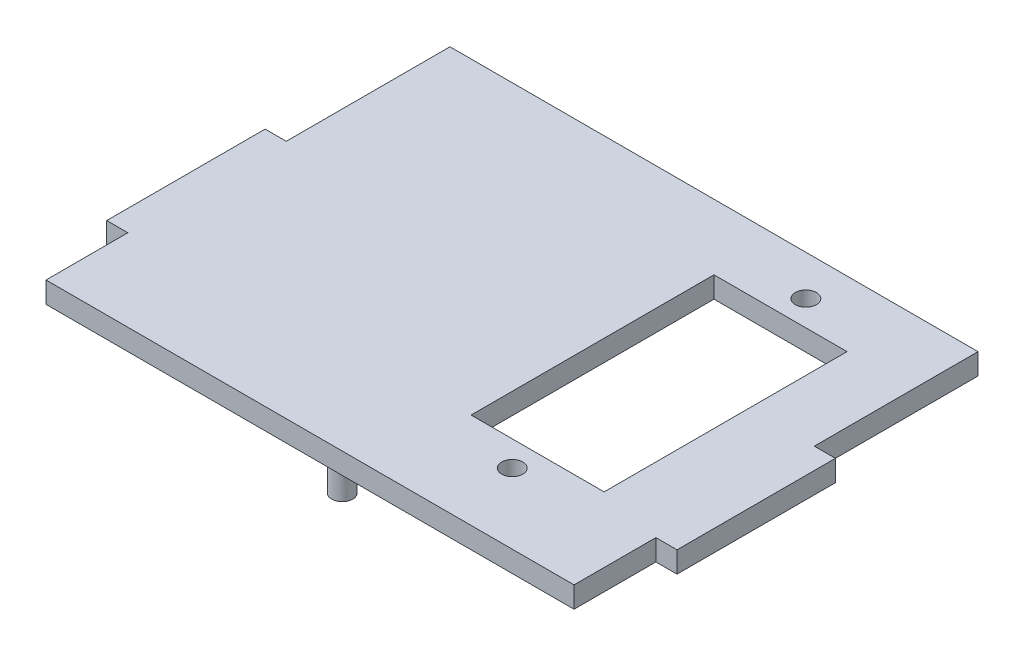
ISO-10303-21;
HEADER;
FILE_DESCRIPTION(('STEP AP214'),'2;1');
FILE_NAME('part.step','',(''),(''),'','','');
FILE_SCHEMA(('AUTOMOTIVE_DESIGN { 1 0 10303 214 1 1 1 1 }'));
ENDSEC;
DATA;
#1=APPLICATION_CONTEXT('core data for automotive mechanical design processes');
#2=APPLICATION_PROTOCOL_DEFINITION('international standard','automotive_design',2000,#1);
#3=PRODUCT_CONTEXT('',#1,'mechanical');
#4=PRODUCT('Part','Part','',(#3));
#5=PRODUCT_RELATED_PRODUCT_CATEGORY('part','',(#4));
#6=PRODUCT_DEFINITION_FORMATION('','',#4);
#7=PRODUCT_DEFINITION_CONTEXT('part definition',#1,'design');
#8=PRODUCT_DEFINITION('design','',#6,#7);
#9=PRODUCT_DEFINITION_SHAPE('','',#8);
#10=(LENGTH_UNIT() NAMED_UNIT(*) SI_UNIT(.MILLI.,.METRE.));
#11=(NAMED_UNIT(*) PLANE_ANGLE_UNIT() SI_UNIT($,.RADIAN.));
#12=(NAMED_UNIT(*) SI_UNIT($,.STERADIAN.) SOLID_ANGLE_UNIT());
#13=UNCERTAINTY_MEASURE_WITH_UNIT(LENGTH_MEASURE(1.E-05),#10,'distance_accuracy_value','');
#14=(GEOMETRIC_REPRESENTATION_CONTEXT(3) GLOBAL_UNCERTAINTY_ASSIGNED_CONTEXT((#13)) GLOBAL_UNIT_ASSIGNED_CONTEXT((#10,
#11,#12)) REPRESENTATION_CONTEXT('',''));
#15=CARTESIAN_POINT('',(0.,0.,0.));
#16=DIRECTION('',(0.,0.,1.));
#17=DIRECTION('',(1.,0.,0.));
#18=AXIS2_PLACEMENT_3D('',#15,#16,#17);
#19=CARTESIAN_POINT('',(0.,2.,0.));
#20=DIRECTION('',(0.,1.,0.));
#21=DIRECTION('',(0.,0.,1.));
#22=AXIS2_PLACEMENT_3D('',#19,#20,#21);
#23=PLANE('',#22);
#24=DIRECTION('',(1.,0.,0.));
#25=VECTOR('',#24,1.);
#26=CARTESIAN_POINT('',(-25.,2.,15.25));
#27=LINE('',#26,#25);
#28=CARTESIAN_POINT('',(-25.,2.,15.25));
#29=VERTEX_POINT('',#28);
#30=CARTESIAN_POINT('',(25.,2.00000000000002,15.25));
#31=VERTEX_POINT('',#30);
#32=EDGE_CURVE('E48',#29,#31,#27,.T.);
#33=ORIENTED_EDGE('',*,*,#32,.T.);
#34=DIRECTION('',(0.,0.,-1.));
#35=VECTOR('',#34,1.);
#36=CARTESIAN_POINT('',(25.,2.,7.49999999999998));
#37=LINE('',#36,#35);
#38=CARTESIAN_POINT('',(25.,2.,7.49999999999998));
#39=VERTEX_POINT('',#38);
#40=EDGE_CURVE('E156',#31,#39,#37,.T.);
#41=ORIENTED_EDGE('',*,*,#40,.T.);
#42=DIRECTION('',(1.,0.,0.));
#43=VECTOR('',#42,1.);
#44=CARTESIAN_POINT('',(27.,2.,7.49999999999998));
#45=LINE('',#44,#43);
#46=CARTESIAN_POINT('',(27.,2.,7.49999999999998));
#47=VERTEX_POINT('',#46);
#48=EDGE_CURVE('E163',#39,#47,#45,.T.);
#49=ORIENTED_EDGE('',*,*,#48,.T.);
#50=DIRECTION('',(0.,0.,-1.));
#51=VECTOR('',#50,1.);
#52=CARTESIAN_POINT('',(27.,2.,-7.50000000000002));
#53=LINE('',#52,#51);
#54=CARTESIAN_POINT('',(27.,2.,-7.50000000000002));
#55=VERTEX_POINT('',#54);
#56=EDGE_CURVE('E166',#47,#55,#53,.T.);
#57=ORIENTED_EDGE('',*,*,#56,.T.);
#58=DIRECTION('',(-1.,0.,0.));
#59=VECTOR('',#58,1.);
#60=CARTESIAN_POINT('',(27.,2.,-7.50000000000002));
#61=LINE('',#60,#59);
#62=CARTESIAN_POINT('',(25.,2.,-7.50000000000002));
#63=VERTEX_POINT('',#62);
#64=EDGE_CURVE('E176',#55,#63,#61,.T.);
#65=ORIENTED_EDGE('',*,*,#64,.T.);
#66=DIRECTION('',(0.,0.,-1.));
#67=VECTOR('',#66,1.);
#68=CARTESIAN_POINT('',(25.,2.,-23.));
#69=LINE('',#68,#67);
#70=CARTESIAN_POINT('',(25.,2.,-23.));
#71=VERTEX_POINT('',#70);
#72=EDGE_CURVE('E178',#63,#71,#69,.T.);
#73=ORIENTED_EDGE('',*,*,#72,.T.);
#74=DIRECTION('',(-1.,0.,0.));
#75=VECTOR('',#74,1.);
#76=CARTESIAN_POINT('',(-25.,2.,-23.));
#77=LINE('',#76,#75);
#78=CARTESIAN_POINT('',(-25.,2.,-23.));
#79=VERTEX_POINT('',#78);
#80=EDGE_CURVE('E180',#71,#79,#77,.T.);
#81=ORIENTED_EDGE('',*,*,#80,.T.);
#82=DIRECTION('',(0.,0.,1.));
#83=VECTOR('',#82,1.);
#84=CARTESIAN_POINT('',(-25.,2.,-23.));
#85=LINE('',#84,#83);
#86=CARTESIAN_POINT('',(-25.,2.,-7.50000000000002));
#87=VERTEX_POINT('',#86);
#88=EDGE_CURVE('E182',#79,#87,#85,.T.);
#89=ORIENTED_EDGE('',*,*,#88,.T.);
#90=DIRECTION('',(-1.,0.,0.));
#91=VECTOR('',#90,1.);
#92=CARTESIAN_POINT('',(-27.,2.,-7.50000000000002));
#93=LINE('',#92,#91);
#94=CARTESIAN_POINT('',(-27.,2.,-7.50000000000002));
#95=VERTEX_POINT('',#94);
#96=EDGE_CURVE('E184',#87,#95,#93,.T.);
#97=ORIENTED_EDGE('',*,*,#96,.T.);
#98=DIRECTION('',(0.,0.,1.));
#99=VECTOR('',#98,1.);
#100=CARTESIAN_POINT('',(-27.,2.,-7.50000000000002));
#101=LINE('',#100,#99);
#102=CARTESIAN_POINT('',(-27.,2.,7.49999999999998));
#103=VERTEX_POINT('',#102);
#104=EDGE_CURVE('E186',#95,#103,#101,.T.);
#105=ORIENTED_EDGE('',*,*,#104,.T.);
#106=DIRECTION('',(1.,0.,0.));
#107=VECTOR('',#106,1.);
#108=CARTESIAN_POINT('',(-27.,2.,7.49999999999998));
#109=LINE('',#108,#107);
#110=CARTESIAN_POINT('',(-25.,2.,7.49999999999998));
#111=VERTEX_POINT('',#110);
#112=EDGE_CURVE('E188',#103,#111,#109,.T.);
#113=ORIENTED_EDGE('',*,*,#112,.T.);
#114=DIRECTION('',(0.,0.,1.));
#115=VECTOR('',#114,1.);
#116=CARTESIAN_POINT('',(-25.,2.,7.49999999999998));
#117=LINE('',#116,#115);
#118=EDGE_CURVE('E159',#111,#29,#117,.T.);
#119=ORIENTED_EDGE('',*,*,#118,.T.);
#120=EDGE_LOOP('',(#33,#41,#49,#57,#65,#73,#81,#89,#97,#105,#113,#119));
#121=FACE_BOUND('',#120,.T.);
#122=CARTESIAN_POINT('',(12.5,2.,-19.2));
#123=DIRECTION('',(0.,1.,0.));
#124=DIRECTION('',(0.,0.,1.));
#125=AXIS2_PLACEMENT_3D('',#122,#123,#124);
#126=CIRCLE('',#125,1.);
#127=CARTESIAN_POINT('',(12.5,2.,-18.2));
#128=VERTEX_POINT('',#127);
#129=EDGE_CURVE('E295',#128,#128,#126,.T.);
#130=ORIENTED_EDGE('',*,*,#129,.F.);
#131=EDGE_LOOP('',(#130));
#132=FACE_BOUND('',#131,.T.);
#133=DIRECTION('',(0.,0.,1.));
#134=VECTOR('',#133,1.);
#135=CARTESIAN_POINT('',(6.2,2.,-16.8));
#136=LINE('',#135,#134);
#137=CARTESIAN_POINT('',(6.2,2.,-16.8));
#138=VERTEX_POINT('',#137);
#139=CARTESIAN_POINT('',(6.2,2.,6.20000000000001));
#140=VERTEX_POINT('',#139);
#141=EDGE_CURVE('E303',#138,#140,#136,.T.);
#142=ORIENTED_EDGE('',*,*,#141,.F.);
#143=DIRECTION('',(-1.,0.,0.));
#144=VECTOR('',#143,1.);
#145=CARTESIAN_POINT('',(6.2,2.,-16.8));
#146=LINE('',#145,#144);
#147=CARTESIAN_POINT('',(18.8,2.,-16.8));
#148=VERTEX_POINT('',#147);
#149=EDGE_CURVE('E301',#148,#138,#146,.T.);
#150=ORIENTED_EDGE('',*,*,#149,.F.);
#151=DIRECTION('',(0.,0.,-1.));
#152=VECTOR('',#151,1.);
#153=CARTESIAN_POINT('',(18.8,2.,-6.19999999999999));
#154=LINE('',#153,#152);
#155=CARTESIAN_POINT('',(18.8,2.,6.20000000000001));
#156=VERTEX_POINT('',#155);
#157=EDGE_CURVE('E308',#156,#148,#154,.T.);
#158=ORIENTED_EDGE('',*,*,#157,.F.);
#159=DIRECTION('',(1.,0.,0.));
#160=VECTOR('',#159,1.);
#161=CARTESIAN_POINT('',(6.2,2.,6.20000000000001));
#162=LINE('',#161,#160);
#163=EDGE_CURVE('E306',#140,#156,#162,.T.);
#164=ORIENTED_EDGE('',*,*,#163,.F.);
#165=EDGE_LOOP('',(#142,#150,#158,#164));
#166=FACE_BOUND('',#165,.T.);
#167=CARTESIAN_POINT('',(12.5,2.,8.60000000000001));
#168=DIRECTION('',(0.,1.,0.));
#169=DIRECTION('',(0.,0.,-1.));
#170=AXIS2_PLACEMENT_3D('',#167,#168,#169);
#171=CIRCLE('',#170,1.);
#172=CARTESIAN_POINT('',(12.5,2.,7.60000000000001));
#173=VERTEX_POINT('',#172);
#174=EDGE_CURVE('E289',#173,#173,#171,.T.);
#175=ORIENTED_EDGE('',*,*,#174,.F.);
#176=EDGE_LOOP('',(#175));
#177=FACE_BOUND('',#176,.T.);
#178=ADVANCED_FACE('F33',(#121,#132,#166,#177),#23,.T.);
#179=CARTESIAN_POINT('',(0.,0.,0.));
#180=DIRECTION('',(0.,1.,0.));
#181=DIRECTION('',(0.,0.,1.));
#182=AXIS2_PLACEMENT_3D('',#179,#180,#181);
#183=PLANE('',#182);
#184=CARTESIAN_POINT('',(-12.5,0.,-0.300349058037386));
#185=DIRECTION('',(0.,1.,0.));
#186=DIRECTION('',(0.,0.,1.));
#187=AXIS2_PLACEMENT_3D('',#184,#185,#186);
#188=CIRCLE('',#187,1.);
#189=CARTESIAN_POINT('',(-12.5,0.,0.699650941962614));
#190=VERTEX_POINT('',#189);
#191=EDGE_CURVE('E11',#190,#190,#188,.F.);
#192=ORIENTED_EDGE('',*,*,#191,.F.);
#193=EDGE_LOOP('',(#192));
#194=FACE_BOUND('',#193,.T.);
#195=DIRECTION('',(0.,0.,-1.));
#196=VECTOR('',#195,1.);
#197=CARTESIAN_POINT('',(25.,0.,7.49999999999998));
#198=LINE('',#197,#196);
#199=CARTESIAN_POINT('',(25.,0.,15.25));
#200=VERTEX_POINT('',#199);
#201=CARTESIAN_POINT('',(25.,0.,7.49999999999998));
#202=VERTEX_POINT('',#201);
#203=EDGE_CURVE('E192',#200,#202,#198,.T.);
#204=ORIENTED_EDGE('',*,*,#203,.F.);
#205=DIRECTION('',(1.,0.,0.));
#206=VECTOR('',#205,1.);
#207=CARTESIAN_POINT('',(-25.,0.,15.25));
#208=LINE('',#207,#206);
#209=CARTESIAN_POINT('',(-25.,0.,15.25));
#210=VERTEX_POINT('',#209);
#211=EDGE_CURVE('E147',#210,#200,#208,.T.);
#212=ORIENTED_EDGE('',*,*,#211,.F.);
#213=DIRECTION('',(0.,0.,1.));
#214=VECTOR('',#213,1.);
#215=CARTESIAN_POINT('',(-25.,0.,7.49999999999998));
#216=LINE('',#215,#214);
#217=CARTESIAN_POINT('',(-25.,0.,7.49999999999998));
#218=VERTEX_POINT('',#217);
#219=EDGE_CURVE('E164',#218,#210,#216,.T.);
#220=ORIENTED_EDGE('',*,*,#219,.F.);
#221=DIRECTION('',(1.,0.,0.));
#222=VECTOR('',#221,1.);
#223=CARTESIAN_POINT('',(-27.,0.,7.49999999999998));
#224=LINE('',#223,#222);
#225=CARTESIAN_POINT('',(-27.,0.,7.49999999999998));
#226=VERTEX_POINT('',#225);
#227=EDGE_CURVE('E169',#226,#218,#224,.T.);
#228=ORIENTED_EDGE('',*,*,#227,.F.);
#229=DIRECTION('',(0.,0.,1.));
#230=VECTOR('',#229,1.);
#231=CARTESIAN_POINT('',(-27.,0.,-7.50000000000002));
#232=LINE('',#231,#230);
#233=CARTESIAN_POINT('',(-27.,0.,-7.50000000000002));
#234=VERTEX_POINT('',#233);
#235=EDGE_CURVE('E208',#234,#226,#232,.T.);
#236=ORIENTED_EDGE('',*,*,#235,.F.);
#237=DIRECTION('',(-1.,0.,0.));
#238=VECTOR('',#237,1.);
#239=CARTESIAN_POINT('',(-27.,0.,-7.50000000000002));
#240=LINE('',#239,#238);
#241=CARTESIAN_POINT('',(-25.,0.,-7.50000000000002));
#242=VERTEX_POINT('',#241);
#243=EDGE_CURVE('E206',#242,#234,#240,.T.);
#244=ORIENTED_EDGE('',*,*,#243,.F.);
#245=DIRECTION('',(0.,0.,1.));
#246=VECTOR('',#245,1.);
#247=CARTESIAN_POINT('',(-25.,0.,-23.));
#248=LINE('',#247,#246);
#249=CARTESIAN_POINT('',(-25.,0.,-23.));
#250=VERTEX_POINT('',#249);
#251=EDGE_CURVE('E204',#250,#242,#248,.T.);
#252=ORIENTED_EDGE('',*,*,#251,.F.);
#253=DIRECTION('',(-1.,0.,0.));
#254=VECTOR('',#253,1.);
#255=CARTESIAN_POINT('',(-25.,0.,-23.));
#256=LINE('',#255,#254);
#257=CARTESIAN_POINT('',(25.,0.,-23.));
#258=VERTEX_POINT('',#257);
#259=EDGE_CURVE('E202',#258,#250,#256,.T.);
#260=ORIENTED_EDGE('',*,*,#259,.F.);
#261=DIRECTION('',(0.,0.,-1.));
#262=VECTOR('',#261,1.);
#263=CARTESIAN_POINT('',(25.,0.,-23.));
#264=LINE('',#263,#262);
#265=CARTESIAN_POINT('',(25.,0.,-7.50000000000002));
#266=VERTEX_POINT('',#265);
#267=EDGE_CURVE('E200',#266,#258,#264,.T.);
#268=ORIENTED_EDGE('',*,*,#267,.F.);
#269=DIRECTION('',(-1.,0.,0.));
#270=VECTOR('',#269,1.);
#271=CARTESIAN_POINT('',(27.,0.,-7.50000000000002));
#272=LINE('',#271,#270);
#273=CARTESIAN_POINT('',(27.,0.,-7.50000000000002));
#274=VERTEX_POINT('',#273);
#275=EDGE_CURVE('E198',#274,#266,#272,.T.);
#276=ORIENTED_EDGE('',*,*,#275,.F.);
#277=DIRECTION('',(0.,0.,-1.));
#278=VECTOR('',#277,1.);
#279=CARTESIAN_POINT('',(27.,0.,-7.50000000000002));
#280=LINE('',#279,#278);
#281=CARTESIAN_POINT('',(27.,0.,7.49999999999998));
#282=VERTEX_POINT('',#281);
#283=EDGE_CURVE('E196',#282,#274,#280,.T.);
#284=ORIENTED_EDGE('',*,*,#283,.F.);
#285=DIRECTION('',(1.,0.,0.));
#286=VECTOR('',#285,1.);
#287=CARTESIAN_POINT('',(27.,0.,7.49999999999998));
#288=LINE('',#287,#286);
#289=EDGE_CURVE('E194',#202,#282,#288,.T.);
#290=ORIENTED_EDGE('',*,*,#289,.F.);
#291=EDGE_LOOP('',(#204,#212,#220,#228,#236,#244,#252,#260,#268,#276,#284,#290));
#292=FACE_BOUND('',#291,.T.);
#293=DIRECTION('',(-1.,0.,0.));
#294=VECTOR('',#293,1.);
#295=CARTESIAN_POINT('',(6.2,0.,-16.8));
#296=LINE('',#295,#294);
#297=CARTESIAN_POINT('',(18.8,0.,-16.8));
#298=VERTEX_POINT('',#297);
#299=CARTESIAN_POINT('',(6.2,0.,-16.8));
#300=VERTEX_POINT('',#299);
#301=EDGE_CURVE('E298',#298,#300,#296,.T.);
#302=ORIENTED_EDGE('',*,*,#301,.T.);
#303=DIRECTION('',(0.,0.,1.));
#304=VECTOR('',#303,1.);
#305=CARTESIAN_POINT('',(6.2,0.,-6.19999999999999));
#306=LINE('',#305,#304);
#307=CARTESIAN_POINT('',(6.2,0.,6.20000000000001));
#308=VERTEX_POINT('',#307);
#309=EDGE_CURVE('E313',#300,#308,#306,.T.);
#310=ORIENTED_EDGE('',*,*,#309,.T.);
#311=DIRECTION('',(1.,0.,0.));
#312=VECTOR('',#311,1.);
#313=CARTESIAN_POINT('',(6.2,0.,6.20000000000001));
#314=LINE('',#313,#312);
#315=CARTESIAN_POINT('',(18.8,0.,6.20000000000001));
#316=VERTEX_POINT('',#315);
#317=EDGE_CURVE('E316',#308,#316,#314,.T.);
#318=ORIENTED_EDGE('',*,*,#317,.T.);
#319=DIRECTION('',(0.,0.,-1.));
#320=VECTOR('',#319,1.);
#321=CARTESIAN_POINT('',(18.8,0.,-16.8));
#322=LINE('',#321,#320);
#323=EDGE_CURVE('E304',#316,#298,#322,.T.);
#324=ORIENTED_EDGE('',*,*,#323,.T.);
#325=EDGE_LOOP('',(#302,#310,#318,#324));
#326=FACE_BOUND('',#325,.T.);
#327=CARTESIAN_POINT('',(12.5,0.,-19.2));
#328=DIRECTION('',(0.,1.,0.));
#329=DIRECTION('',(0.,0.,1.));
#330=AXIS2_PLACEMENT_3D('',#327,#328,#329);
#331=CIRCLE('',#330,1.);
#332=CARTESIAN_POINT('',(12.5,0.,-18.2));
#333=VERTEX_POINT('',#332);
#334=EDGE_CURVE('E292',#333,#333,#331,.T.);
#335=ORIENTED_EDGE('',*,*,#334,.T.);
#336=EDGE_LOOP('',(#335));
#337=FACE_BOUND('',#336,.T.);
#338=CARTESIAN_POINT('',(12.5,0.,8.60000000000001));
#339=DIRECTION('',(0.,1.,0.));
#340=DIRECTION('',(0.,0.,-1.));
#341=AXIS2_PLACEMENT_3D('',#338,#339,#340);
#342=CIRCLE('',#341,1.);
#343=CARTESIAN_POINT('',(12.5,0.,7.60000000000001));
#344=VERTEX_POINT('',#343);
#345=EDGE_CURVE('E286',#344,#344,#342,.T.);
#346=ORIENTED_EDGE('',*,*,#345,.T.);
#347=EDGE_LOOP('',(#346));
#348=FACE_BOUND('',#347,.T.);
#349=ADVANCED_FACE('F335',(#194,#292,#326,#337,#348),#183,.F.);
#350=CARTESIAN_POINT('',(25.,2.,7.49999999999998));
#351=DIRECTION('',(-1.,0.,0.));
#352=DIRECTION('',(0.,0.,1.));
#353=AXIS2_PLACEMENT_3D('',#350,#351,#352);
#354=PLANE('',#353);
#355=ORIENTED_EDGE('',*,*,#40,.F.);
#356=DIRECTION('',(0.,-1.,0.));
#357=VECTOR('',#356,1.);
#358=CARTESIAN_POINT('',(25.,52.5970601912799,15.25));
#359=LINE('',#358,#357);
#360=EDGE_CURVE('E144',#31,#200,#359,.T.);
#361=ORIENTED_EDGE('',*,*,#360,.T.);
#362=ORIENTED_EDGE('',*,*,#203,.T.);
#363=DIRECTION('',(0.,-1.,0.));
#364=VECTOR('',#363,1.);
#365=CARTESIAN_POINT('',(25.,2.,7.49999999999998));
#366=LINE('',#365,#364);
#367=EDGE_CURVE('E41',#39,#202,#366,.T.);
#368=ORIENTED_EDGE('',*,*,#367,.F.);
#369=EDGE_LOOP('',(#355,#361,#362,#368));
#370=FACE_BOUND('',#369,.T.);
#371=ADVANCED_FACE('F35',(#370),#354,.F.);
#372=CARTESIAN_POINT('',(27.,2.,7.49999999999998));
#373=DIRECTION('',(0.,0.,-1.));
#374=DIRECTION('',(-1.,0.,0.));
#375=AXIS2_PLACEMENT_3D('',#372,#373,#374);
#376=PLANE('',#375);
#377=ORIENTED_EDGE('',*,*,#289,.T.);
#378=DIRECTION('',(0.,-1.,0.));
#379=VECTOR('',#378,1.);
#380=CARTESIAN_POINT('',(27.,2.,7.49999999999998));
#381=LINE('',#380,#379);
#382=EDGE_CURVE('E234',#47,#282,#381,.T.);
#383=ORIENTED_EDGE('',*,*,#382,.F.);
#384=ORIENTED_EDGE('',*,*,#48,.F.);
#385=ORIENTED_EDGE('',*,*,#367,.T.);
#386=EDGE_LOOP('',(#377,#383,#384,#385));
#387=FACE_BOUND('',#386,.T.);
#388=ADVANCED_FACE('F237',(#387),#376,.F.);
#389=CARTESIAN_POINT('',(27.,2.,-7.50000000000002));
#390=DIRECTION('',(-1.,0.,0.));
#391=DIRECTION('',(0.,0.,1.));
#392=AXIS2_PLACEMENT_3D('',#389,#390,#391);
#393=PLANE('',#392);
#394=ORIENTED_EDGE('',*,*,#283,.T.);
#395=DIRECTION('',(0.,-1.,0.));
#396=VECTOR('',#395,1.);
#397=CARTESIAN_POINT('',(27.,2.,-7.50000000000002));
#398=LINE('',#397,#396);
#399=EDGE_CURVE('E231',#55,#274,#398,.T.);
#400=ORIENTED_EDGE('',*,*,#399,.F.);
#401=ORIENTED_EDGE('',*,*,#56,.F.);
#402=ORIENTED_EDGE('',*,*,#382,.T.);
#403=EDGE_LOOP('',(#394,#400,#401,#402));
#404=FACE_BOUND('',#403,.T.);
#405=ADVANCED_FACE('F245',(#404),#393,.F.);
#406=CARTESIAN_POINT('',(27.,2.,-7.50000000000002));
#407=DIRECTION('',(0.,0.,1.));
#408=DIRECTION('',(1.,0.,0.));
#409=AXIS2_PLACEMENT_3D('',#406,#407,#408);
#410=PLANE('',#409);
#411=ORIENTED_EDGE('',*,*,#275,.T.);
#412=DIRECTION('',(0.,-1.,0.));
#413=VECTOR('',#412,1.);
#414=CARTESIAN_POINT('',(25.,2.,-7.50000000000002));
#415=LINE('',#414,#413);
#416=EDGE_CURVE('E228',#63,#266,#415,.T.);
#417=ORIENTED_EDGE('',*,*,#416,.F.);
#418=ORIENTED_EDGE('',*,*,#64,.F.);
#419=ORIENTED_EDGE('',*,*,#399,.T.);
#420=EDGE_LOOP('',(#411,#417,#418,#419));
#421=FACE_BOUND('',#420,.T.);
#422=ADVANCED_FACE('F249',(#421),#410,.F.);
#423=CARTESIAN_POINT('',(25.,2.,-23.));
#424=DIRECTION('',(-1.,0.,0.));
#425=DIRECTION('',(0.,0.,1.));
#426=AXIS2_PLACEMENT_3D('',#423,#424,#425);
#427=PLANE('',#426);
#428=ORIENTED_EDGE('',*,*,#267,.T.);
#429=DIRECTION('',(0.,-1.,0.));
#430=VECTOR('',#429,1.);
#431=CARTESIAN_POINT('',(25.,2.,-23.));
#432=LINE('',#431,#430);
#433=EDGE_CURVE('E225',#71,#258,#432,.T.);
#434=ORIENTED_EDGE('',*,*,#433,.F.);
#435=ORIENTED_EDGE('',*,*,#72,.F.);
#436=ORIENTED_EDGE('',*,*,#416,.T.);
#437=EDGE_LOOP('',(#428,#434,#435,#436));
#438=FACE_BOUND('',#437,.T.);
#439=ADVANCED_FACE('F254',(#438),#427,.F.);
#440=CARTESIAN_POINT('',(-25.,2.,-23.));
#441=DIRECTION('',(0.,0.,1.));
#442=DIRECTION('',(1.,0.,0.));
#443=AXIS2_PLACEMENT_3D('',#440,#441,#442);
#444=PLANE('',#443);
#445=ORIENTED_EDGE('',*,*,#259,.T.);
#446=DIRECTION('',(0.,-1.,0.));
#447=VECTOR('',#446,1.);
#448=CARTESIAN_POINT('',(-25.,2.,-23.));
#449=LINE('',#448,#447);
#450=EDGE_CURVE('E222',#79,#250,#449,.T.);
#451=ORIENTED_EDGE('',*,*,#450,.F.);
#452=ORIENTED_EDGE('',*,*,#80,.F.);
#453=ORIENTED_EDGE('',*,*,#433,.T.);
#454=EDGE_LOOP('',(#445,#451,#452,#453));
#455=FACE_BOUND('',#454,.T.);
#456=ADVANCED_FACE('F260',(#455),#444,.F.);
#457=CARTESIAN_POINT('',(-25.,2.,-23.));
#458=DIRECTION('',(1.,0.,0.));
#459=DIRECTION('',(0.,0.,-1.));
#460=AXIS2_PLACEMENT_3D('',#457,#458,#459);
#461=PLANE('',#460);
#462=ORIENTED_EDGE('',*,*,#251,.T.);
#463=DIRECTION('',(0.,-1.,0.));
#464=VECTOR('',#463,1.);
#465=CARTESIAN_POINT('',(-25.,2.,-7.50000000000002));
#466=LINE('',#465,#464);
#467=EDGE_CURVE('E219',#87,#242,#466,.T.);
#468=ORIENTED_EDGE('',*,*,#467,.F.);
#469=ORIENTED_EDGE('',*,*,#88,.F.);
#470=ORIENTED_EDGE('',*,*,#450,.T.);
#471=EDGE_LOOP('',(#462,#468,#469,#470));
#472=FACE_BOUND('',#471,.T.);
#473=ADVANCED_FACE('F264',(#472),#461,.F.);
#474=CARTESIAN_POINT('',(-27.,2.,-7.50000000000002));
#475=DIRECTION('',(0.,0.,1.));
#476=DIRECTION('',(1.,0.,0.));
#477=AXIS2_PLACEMENT_3D('',#474,#475,#476);
#478=PLANE('',#477);
#479=ORIENTED_EDGE('',*,*,#243,.T.);
#480=DIRECTION('',(0.,-1.,0.));
#481=VECTOR('',#480,1.);
#482=CARTESIAN_POINT('',(-27.,2.,-7.50000000000002));
#483=LINE('',#482,#481);
#484=EDGE_CURVE('E216',#95,#234,#483,.T.);
#485=ORIENTED_EDGE('',*,*,#484,.F.);
#486=ORIENTED_EDGE('',*,*,#96,.F.);
#487=ORIENTED_EDGE('',*,*,#467,.T.);
#488=EDGE_LOOP('',(#479,#485,#486,#487));
#489=FACE_BOUND('',#488,.T.);
#490=ADVANCED_FACE('F269',(#489),#478,.F.);
#491=CARTESIAN_POINT('',(-27.,2.,-7.50000000000002));
#492=DIRECTION('',(1.,0.,0.));
#493=DIRECTION('',(0.,0.,-1.));
#494=AXIS2_PLACEMENT_3D('',#491,#492,#493);
#495=PLANE('',#494);
#496=ORIENTED_EDGE('',*,*,#235,.T.);
#497=DIRECTION('',(0.,-1.,0.));
#498=VECTOR('',#497,1.);
#499=CARTESIAN_POINT('',(-27.,2.,7.49999999999998));
#500=LINE('',#499,#498);
#501=EDGE_CURVE('E213',#103,#226,#500,.T.);
#502=ORIENTED_EDGE('',*,*,#501,.F.);
#503=ORIENTED_EDGE('',*,*,#104,.F.);
#504=ORIENTED_EDGE('',*,*,#484,.T.);
#505=EDGE_LOOP('',(#496,#502,#503,#504));
#506=FACE_BOUND('',#505,.T.);
#507=ADVANCED_FACE('F275',(#506),#495,.F.);
#508=CARTESIAN_POINT('',(-27.,2.,7.49999999999998));
#509=DIRECTION('',(0.,0.,-1.));
#510=DIRECTION('',(-1.,0.,0.));
#511=AXIS2_PLACEMENT_3D('',#508,#509,#510);
#512=PLANE('',#511);
#513=ORIENTED_EDGE('',*,*,#227,.T.);
#514=DIRECTION('',(0.,-1.,0.));
#515=VECTOR('',#514,1.);
#516=CARTESIAN_POINT('',(-25.,2.,7.49999999999998));
#517=LINE('',#516,#515);
#518=EDGE_CURVE('E191',#111,#218,#517,.T.);
#519=ORIENTED_EDGE('',*,*,#518,.F.);
#520=ORIENTED_EDGE('',*,*,#112,.F.);
#521=ORIENTED_EDGE('',*,*,#501,.T.);
#522=EDGE_LOOP('',(#513,#519,#520,#521));
#523=FACE_BOUND('',#522,.T.);
#524=ADVANCED_FACE('F279',(#523),#512,.F.);
#525=CARTESIAN_POINT('',(-25.,2.,7.49999999999998));
#526=DIRECTION('',(1.,0.,0.));
#527=DIRECTION('',(0.,0.,-1.));
#528=AXIS2_PLACEMENT_3D('',#525,#526,#527);
#529=PLANE('',#528);
#530=ORIENTED_EDGE('',*,*,#219,.T.);
#531=DIRECTION('',(0.,-1.,0.));
#532=VECTOR('',#531,1.);
#533=CARTESIAN_POINT('',(-25.,52.5970601912799,15.25));
#534=LINE('',#533,#532);
#535=EDGE_CURVE('E151',#29,#210,#534,.T.);
#536=ORIENTED_EDGE('',*,*,#535,.F.);
#537=ORIENTED_EDGE('',*,*,#118,.F.);
#538=ORIENTED_EDGE('',*,*,#518,.T.);
#539=EDGE_LOOP('',(#530,#536,#537,#538));
#540=FACE_BOUND('',#539,.T.);
#541=ADVANCED_FACE('F282',(#540),#529,.F.);
#542=CARTESIAN_POINT('',(6.2,2.,-16.8));
#543=DIRECTION('',(0.,0.,1.));
#544=DIRECTION('',(1.,0.,0.));
#545=AXIS2_PLACEMENT_3D('',#542,#543,#544);
#546=PLANE('',#545);
#547=ORIENTED_EDGE('',*,*,#301,.F.);
#548=DIRECTION('',(0.,-1.,0.));
#549=VECTOR('',#548,1.);
#550=CARTESIAN_POINT('',(18.8,2.,-16.8));
#551=LINE('',#550,#549);
#552=EDGE_CURVE('E310',#148,#298,#551,.T.);
#553=ORIENTED_EDGE('',*,*,#552,.F.);
#554=ORIENTED_EDGE('',*,*,#149,.T.);
#555=DIRECTION('',(0.,-1.,0.));
#556=VECTOR('',#555,1.);
#557=CARTESIAN_POINT('',(6.2,2.,-16.8));
#558=LINE('',#557,#556);
#559=EDGE_CURVE('E172',#138,#300,#558,.T.);
#560=ORIENTED_EDGE('',*,*,#559,.T.);
#561=EDGE_LOOP('',(#547,#553,#554,#560));
#562=FACE_BOUND('',#561,.T.);
#563=ADVANCED_FACE('F330',(#562),#546,.T.);
#564=CARTESIAN_POINT('',(6.2,2.,-6.19999999999999));
#565=DIRECTION('',(1.,0.,0.));
#566=DIRECTION('',(0.,0.,-1.));
#567=AXIS2_PLACEMENT_3D('',#564,#565,#566);
#568=PLANE('',#567);
#569=ORIENTED_EDGE('',*,*,#309,.F.);
#570=ORIENTED_EDGE('',*,*,#559,.F.);
#571=ORIENTED_EDGE('',*,*,#141,.T.);
#572=DIRECTION('',(0.,-1.,0.));
#573=VECTOR('',#572,1.);
#574=CARTESIAN_POINT('',(6.2,2.,6.20000000000001));
#575=LINE('',#574,#573);
#576=EDGE_CURVE('E323',#140,#308,#575,.T.);
#577=ORIENTED_EDGE('',*,*,#576,.T.);
#578=EDGE_LOOP('',(#569,#570,#571,#577));
#579=FACE_BOUND('',#578,.T.);
#580=ADVANCED_FACE('F344',(#579),#568,.T.);
#581=CARTESIAN_POINT('',(6.2,2.,6.20000000000001));
#582=DIRECTION('',(0.,0.,-1.));
#583=DIRECTION('',(-1.,0.,0.));
#584=AXIS2_PLACEMENT_3D('',#581,#582,#583);
#585=PLANE('',#584);
#586=ORIENTED_EDGE('',*,*,#317,.F.);
#587=ORIENTED_EDGE('',*,*,#576,.F.);
#588=ORIENTED_EDGE('',*,*,#163,.T.);
#589=DIRECTION('',(0.,-1.,0.));
#590=VECTOR('',#589,1.);
#591=CARTESIAN_POINT('',(18.8,2.,6.20000000000001));
#592=LINE('',#591,#590);
#593=EDGE_CURVE('E56',#156,#316,#592,.T.);
#594=ORIENTED_EDGE('',*,*,#593,.T.);
#595=EDGE_LOOP('',(#586,#587,#588,#594));
#596=FACE_BOUND('',#595,.T.);
#597=ADVANCED_FACE('F339',(#596),#585,.T.);
#598=CARTESIAN_POINT('',(18.8,2.,-16.8));
#599=DIRECTION('',(-1.,0.,0.));
#600=DIRECTION('',(0.,0.,1.));
#601=AXIS2_PLACEMENT_3D('',#598,#599,#600);
#602=PLANE('',#601);
#603=ORIENTED_EDGE('',*,*,#323,.F.);
#604=ORIENTED_EDGE('',*,*,#593,.F.);
#605=ORIENTED_EDGE('',*,*,#157,.T.);
#606=ORIENTED_EDGE('',*,*,#552,.T.);
#607=EDGE_LOOP('',(#603,#604,#605,#606));
#608=FACE_BOUND('',#607,.T.);
#609=ADVANCED_FACE('F337',(#608),#602,.T.);
#610=CARTESIAN_POINT('',(12.5,2.,-19.2));
#611=DIRECTION('',(0.,-1.,0.));
#612=DIRECTION('',(0.,0.,-1.));
#613=AXIS2_PLACEMENT_3D('',#610,#611,#612);
#614=CYLINDRICAL_SURFACE('',#613,1.);
#615=ORIENTED_EDGE('',*,*,#129,.T.);
#616=EDGE_LOOP('',(#615));
#617=FACE_BOUND('',#616,.T.);
#618=ORIENTED_EDGE('',*,*,#334,.F.);
#619=EDGE_LOOP('',(#618));
#620=FACE_BOUND('',#619,.T.);
#621=ADVANCED_FACE('F425',(#617,#620),#614,.F.);
#622=CARTESIAN_POINT('',(12.5,2.,8.60000000000001));
#623=DIRECTION('',(0.,-1.,0.));
#624=DIRECTION('',(0.,0.,-1.));
#625=AXIS2_PLACEMENT_3D('',#622,#623,#624);
#626=CYLINDRICAL_SURFACE('',#625,1.);
#627=ORIENTED_EDGE('',*,*,#174,.T.);
#628=EDGE_LOOP('',(#627));
#629=FACE_BOUND('',#628,.T.);
#630=ORIENTED_EDGE('',*,*,#345,.F.);
#631=EDGE_LOOP('',(#630));
#632=FACE_BOUND('',#631,.T.);
#633=ADVANCED_FACE('F415',(#629,#632),#626,.F.);
#634=CARTESIAN_POINT('',(-12.5,-17.,-0.300349058037386));
#635=DIRECTION('',(0.,1.,0.));
#636=DIRECTION('',(0.,0.,1.));
#637=AXIS2_PLACEMENT_3D('',#634,#635,#636);
#638=CYLINDRICAL_SURFACE('',#637,1.);
#639=CARTESIAN_POINT('',(-12.5,-17.,-0.300349058037386));
#640=DIRECTION('',(0.,-1.,0.));
#641=DIRECTION('',(0.,0.,-1.));
#642=AXIS2_PLACEMENT_3D('',#639,#640,#641);
#643=CIRCLE('',#642,1.);
#644=CARTESIAN_POINT('',(-12.5,-17.,-1.30034905803739));
#645=VERTEX_POINT('',#644);
#646=EDGE_CURVE('E283',#645,#645,#643,.T.);
#647=ORIENTED_EDGE('',*,*,#646,.F.);
#648=EDGE_LOOP('',(#647));
#649=FACE_BOUND('',#648,.T.);
#650=ORIENTED_EDGE('',*,*,#191,.T.);
#651=EDGE_LOOP('',(#650));
#652=FACE_BOUND('',#651,.T.);
#653=ADVANCED_FACE('F403',(#649,#652),#638,.T.);
#654=CARTESIAN_POINT('',(-12.5,-17.,-0.300349058037386));
#655=DIRECTION('',(0.,-1.,0.));
#656=DIRECTION('',(0.,0.,-1.));
#657=AXIS2_PLACEMENT_3D('',#654,#655,#656);
#658=PLANE('',#657);
#659=ORIENTED_EDGE('',*,*,#646,.T.);
#660=EDGE_LOOP('',(#659));
#661=FACE_BOUND('',#660,.T.);
#662=ADVANCED_FACE('F398',(#661),#658,.T.);
#663=CARTESIAN_POINT('',(-25.,52.5970601912799,15.25));
#664=DIRECTION('',(0.,0.,-1.));
#665=DIRECTION('',(-1.,0.,0.));
#666=AXIS2_PLACEMENT_3D('',#663,#664,#665);
#667=PLANE('',#666);
#668=ORIENTED_EDGE('',*,*,#535,.T.);
#669=ORIENTED_EDGE('',*,*,#211,.T.);
#670=ORIENTED_EDGE('',*,*,#360,.F.);
#671=ORIENTED_EDGE('',*,*,#32,.F.);
#672=EDGE_LOOP('',(#668,#669,#670,#671));
#673=FACE_BOUND('',#672,.T.);
#674=ADVANCED_FACE('F145',(#673),#667,.F.);
#675=CLOSED_SHELL('',(#178,#349,#371,#388,#405,#422,#439,#456,#473,#490,#507,#524,#541,#563,
#580,#597,#609,#621,#633,#653,#662,#674));
#676=MANIFOLD_SOLID_BREP('B2',#675);
#677=ADVANCED_BREP_SHAPE_REPRESENTATION('',(#18,#676),#14);
#678=SHAPE_DEFINITION_REPRESENTATION(#9,#677);
ENDSEC;
END-ISO-10303-21;
